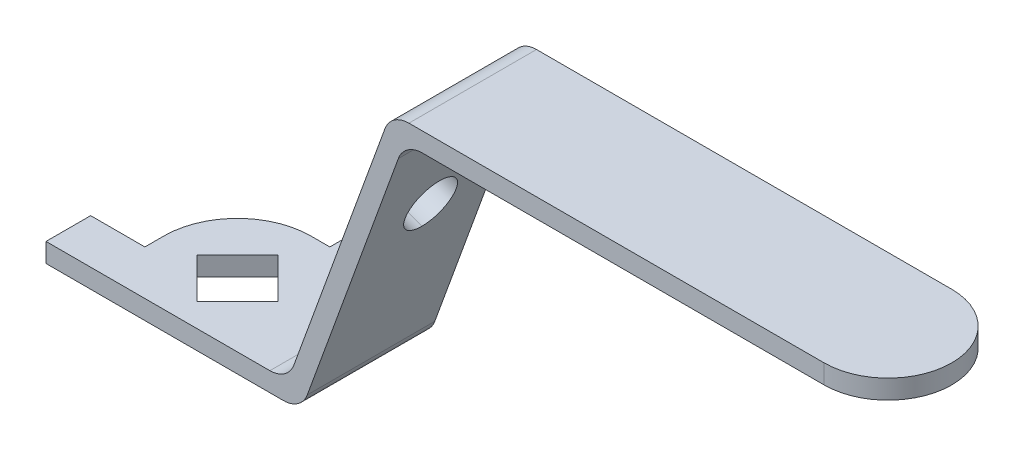
ISO-10303-21;
HEADER;
FILE_DESCRIPTION(('STEP AP214'),'2;1');
FILE_NAME('part.step','',(''),(''),'','','');
FILE_SCHEMA(('AUTOMOTIVE_DESIGN { 1 0 10303 214 1 1 1 1 }'));
ENDSEC;
DATA;
#1=APPLICATION_CONTEXT('core data for automotive mechanical design processes');
#2=APPLICATION_PROTOCOL_DEFINITION('international standard','automotive_design',2000,#1);
#3=PRODUCT_CONTEXT('',#1,'mechanical');
#4=PRODUCT('Part','Part','',(#3));
#5=PRODUCT_RELATED_PRODUCT_CATEGORY('part','',(#4));
#6=PRODUCT_DEFINITION_FORMATION('','',#4);
#7=PRODUCT_DEFINITION_CONTEXT('part definition',#1,'design');
#8=PRODUCT_DEFINITION('design','',#6,#7);
#9=PRODUCT_DEFINITION_SHAPE('','',#8);
#10=(LENGTH_UNIT() NAMED_UNIT(*) SI_UNIT(.MILLI.,.METRE.));
#11=(NAMED_UNIT(*) PLANE_ANGLE_UNIT() SI_UNIT($,.RADIAN.));
#12=(NAMED_UNIT(*) SI_UNIT($,.STERADIAN.) SOLID_ANGLE_UNIT());
#13=UNCERTAINTY_MEASURE_WITH_UNIT(LENGTH_MEASURE(1.E-05),#10,'distance_accuracy_value','');
#14=(GEOMETRIC_REPRESENTATION_CONTEXT(3) GLOBAL_UNCERTAINTY_ASSIGNED_CONTEXT((#13)) GLOBAL_UNIT_ASSIGNED_CONTEXT((#10,
#11,#12)) REPRESENTATION_CONTEXT('',''));
#15=CARTESIAN_POINT('',(0.,0.,0.));
#16=DIRECTION('',(0.,0.,1.));
#17=DIRECTION('',(1.,0.,0.));
#18=AXIS2_PLACEMENT_3D('',#15,#16,#17);
#19=CARTESIAN_POINT('',(33.9922257180665,62.7433443998355,74.1271242589921));
#20=DIRECTION('',(0.,0.,-1.));
#21=DIRECTION('',(1.,0.,0.));
#22=AXIS2_PLACEMENT_3D('',#19,#20,#21);
#23=CYLINDRICAL_SURFACE('',#22,4.);
#24=CARTESIAN_POINT('',(33.9922257180665,62.7433443998355,64.127124258992));
#25=DIRECTION('',(0.,0.,1.));
#26=DIRECTION('',(-1.,0.,0.));
#27=AXIS2_PLACEMENT_3D('',#24,#25,#26);
#28=CIRCLE('',#27,4.);
#29=CARTESIAN_POINT('',(33.9922257180665,66.7433443998355,64.127124258992));
#30=VERTEX_POINT('',#29);
#31=CARTESIAN_POINT('',(30.2334552349229,64.1114249731381,64.127124258992));
#32=VERTEX_POINT('',#31);
#33=EDGE_CURVE('E446',#30,#32,#28,.T.);
#34=ORIENTED_EDGE('',*,*,#33,.F.);
#35=DIRECTION('',(0.,0.,1.));
#36=VECTOR('',#35,1.);
#37=CARTESIAN_POINT('',(33.9922257180665,66.7433443998355,74.1271242589921));
#38=LINE('',#37,#36);
#39=CARTESIAN_POINT('',(33.9922257180665,66.7433443998355,44.127124258992));
#40=VERTEX_POINT('',#39);
#41=EDGE_CURVE('E276',#40,#30,#38,.T.);
#42=ORIENTED_EDGE('',*,*,#41,.F.);
#43=CARTESIAN_POINT('',(33.9922257180665,62.7433443998355,44.127124258992));
#44=DIRECTION('',(0.,0.,-1.));
#45=DIRECTION('',(-1.,0.,0.));
#46=AXIS2_PLACEMENT_3D('',#43,#44,#45);
#47=CIRCLE('',#46,4.);
#48=CARTESIAN_POINT('',(30.2334552349229,64.1114249731381,44.127124258992));
#49=VERTEX_POINT('',#48);
#50=EDGE_CURVE('E295',#49,#40,#47,.T.);
#51=ORIENTED_EDGE('',*,*,#50,.F.);
#52=DIRECTION('',(0.,0.,-1.));
#53=VECTOR('',#52,1.);
#54=CARTESIAN_POINT('',(30.2334552349229,64.1114249731381,74.1271242589921));
#55=LINE('',#54,#53);
#56=EDGE_CURVE('E332',#32,#49,#55,.T.);
#57=ORIENTED_EDGE('',*,*,#56,.F.);
#58=EDGE_LOOP('',(#34,#42,#51,#57));
#59=FACE_BOUND('',#58,.T.);
#60=ADVANCED_FACE('F16',(#59),#23,.T.);
#61=CARTESIAN_POINT('',(12.1915589660648,26.23693997096,74.1271242589921));
#62=DIRECTION('',(0.,0.,1.));
#63=DIRECTION('',(-1.,0.,0.));
#64=AXIS2_PLACEMENT_3D('',#61,#62,#63);
#65=CYLINDRICAL_SURFACE('',#64,4.);
#66=CARTESIAN_POINT('',(12.1915589660648,26.23693997096,64.127124258992));
#67=DIRECTION('',(0.,0.,-1.));
#68=DIRECTION('',(-1.,0.,0.));
#69=AXIS2_PLACEMENT_3D('',#66,#67,#68);
#70=CIRCLE('',#69,4.);
#71=CARTESIAN_POINT('',(15.9503294492085,24.8688593976574,64.127124258992));
#72=VERTEX_POINT('',#71);
#73=CARTESIAN_POINT('',(12.1915589660648,22.23693997096,64.127124258992));
#74=VERTEX_POINT('',#73);
#75=EDGE_CURVE('E442',#72,#74,#70,.T.);
#76=ORIENTED_EDGE('',*,*,#75,.F.);
#77=DIRECTION('',(0.,0.,1.));
#78=VECTOR('',#77,1.);
#79=CARTESIAN_POINT('',(15.9503294492085,24.8688593976574,64.127124258992));
#80=LINE('',#79,#78);
#81=CARTESIAN_POINT('',(15.9503294492085,24.8688593976574,44.127124258992));
#82=VERTEX_POINT('',#81);
#83=EDGE_CURVE('E319',#82,#72,#80,.T.);
#84=ORIENTED_EDGE('',*,*,#83,.F.);
#85=CARTESIAN_POINT('',(12.1915589660648,26.23693997096,44.127124258992));
#86=DIRECTION('',(0.,0.,1.));
#87=DIRECTION('',(-1.,0.,0.));
#88=AXIS2_PLACEMENT_3D('',#85,#86,#87);
#89=CIRCLE('',#88,4.);
#90=CARTESIAN_POINT('',(12.1915589660648,22.23693997096,44.127124258992));
#91=VERTEX_POINT('',#90);
#92=EDGE_CURVE('E299',#91,#82,#89,.T.);
#93=ORIENTED_EDGE('',*,*,#92,.F.);
#94=DIRECTION('',(0.,0.,-1.));
#95=VECTOR('',#94,1.);
#96=CARTESIAN_POINT('',(12.1915589660648,22.23693997096,44.127124258992));
#97=LINE('',#96,#95);
#98=EDGE_CURVE('E362',#74,#91,#97,.T.);
#99=ORIENTED_EDGE('',*,*,#98,.F.);
#100=EDGE_LOOP('',(#76,#84,#93,#99));
#101=FACE_BOUND('',#100,.T.);
#102=ADVANCED_FACE('F591',(#101),#65,.F.);
#103=CARTESIAN_POINT('',(14.292181580694,23.23693997096,74.1271242589921));
#104=DIRECTION('',(0.,0.,-1.));
#105=DIRECTION('',(1.,0.,0.));
#106=AXIS2_PLACEMENT_3D('',#103,#104,#105);
#107=CYLINDRICAL_SURFACE('',#106,4.);
#108=CARTESIAN_POINT('',(14.292181580694,23.23693997096,64.127124258992));
#109=DIRECTION('',(0.,0.,1.));
#110=DIRECTION('',(-1.,0.,0.));
#111=AXIS2_PLACEMENT_3D('',#108,#109,#110);
#112=CIRCLE('',#111,4.);
#113=CARTESIAN_POINT('',(14.292181580694,19.23693997096,64.127124258992));
#114=VERTEX_POINT('',#113);
#115=CARTESIAN_POINT('',(18.0509520638376,21.8688593976574,64.127124258992));
#116=VERTEX_POINT('',#115);
#117=EDGE_CURVE('E36',#114,#116,#112,.T.);
#118=ORIENTED_EDGE('',*,*,#117,.F.);
#119=DIRECTION('',(0.,0.,1.));
#120=VECTOR('',#119,1.);
#121=CARTESIAN_POINT('',(14.292181580694,19.23693997096,74.1271242589921));
#122=LINE('',#121,#120);
#123=CARTESIAN_POINT('',(14.292181580694,19.23693997096,44.127124258992));
#124=VERTEX_POINT('',#123);
#125=EDGE_CURVE('E421',#124,#114,#122,.T.);
#126=ORIENTED_EDGE('',*,*,#125,.F.);
#127=CARTESIAN_POINT('',(14.292181580694,23.23693997096,44.127124258992));
#128=DIRECTION('',(0.,0.,-1.));
#129=DIRECTION('',(-1.,0.,0.));
#130=AXIS2_PLACEMENT_3D('',#127,#128,#129);
#131=CIRCLE('',#130,4.);
#132=CARTESIAN_POINT('',(18.0509520638376,21.8688593976574,44.127124258992));
#133=VERTEX_POINT('',#132);
#134=EDGE_CURVE('E502',#133,#124,#131,.T.);
#135=ORIENTED_EDGE('',*,*,#134,.F.);
#136=DIRECTION('',(0.,0.,-1.));
#137=VECTOR('',#136,1.);
#138=CARTESIAN_POINT('',(18.0509520638376,21.8688593976574,74.1271242589921));
#139=LINE('',#138,#137);
#140=EDGE_CURVE('E249',#116,#133,#139,.T.);
#141=ORIENTED_EDGE('',*,*,#140,.F.);
#142=EDGE_LOOP('',(#118,#126,#135,#141));
#143=FACE_BOUND('',#142,.T.);
#144=ADVANCED_FACE('F550',(#143),#107,.T.);
#145=CARTESIAN_POINT('',(36.0928483326956,59.7433443998355,74.1271242589921));
#146=DIRECTION('',(0.,0.,1.));
#147=DIRECTION('',(-1.,0.,0.));
#148=AXIS2_PLACEMENT_3D('',#145,#146,#147);
#149=CYLINDRICAL_SURFACE('',#148,4.);
#150=CARTESIAN_POINT('',(36.0928483326956,59.7433443998355,64.127124258992));
#151=DIRECTION('',(0.,0.,-1.));
#152=DIRECTION('',(-1.,0.,0.));
#153=AXIS2_PLACEMENT_3D('',#150,#151,#152);
#154=CIRCLE('',#153,4.);
#155=CARTESIAN_POINT('',(32.334077849552,61.1114249731381,64.127124258992));
#156=VERTEX_POINT('',#155);
#157=CARTESIAN_POINT('',(36.0928483326956,63.7433443998355,64.127124258992));
#158=VERTEX_POINT('',#157);
#159=EDGE_CURVE('E46',#156,#158,#154,.T.);
#160=ORIENTED_EDGE('',*,*,#159,.F.);
#161=DIRECTION('',(0.,0.,1.));
#162=VECTOR('',#161,1.);
#163=CARTESIAN_POINT('',(32.334077849552,61.1114249731381,64.127124258992));
#164=LINE('',#163,#162);
#165=CARTESIAN_POINT('',(32.334077849552,61.1114249731381,44.127124258992));
#166=VERTEX_POINT('',#165);
#167=EDGE_CURVE('E472',#166,#156,#164,.T.);
#168=ORIENTED_EDGE('',*,*,#167,.F.);
#169=CARTESIAN_POINT('',(36.0928483326956,59.7433443998355,44.127124258992));
#170=DIRECTION('',(0.,0.,1.));
#171=DIRECTION('',(-1.,0.,0.));
#172=AXIS2_PLACEMENT_3D('',#169,#170,#171);
#173=CIRCLE('',#172,4.);
#174=CARTESIAN_POINT('',(36.0928483326956,63.7433443998355,44.127124258992));
#175=VERTEX_POINT('',#174);
#176=EDGE_CURVE('E298',#175,#166,#173,.T.);
#177=ORIENTED_EDGE('',*,*,#176,.F.);
#178=DIRECTION('',(0.,0.,-1.));
#179=VECTOR('',#178,1.);
#180=CARTESIAN_POINT('',(36.0928483326956,63.7433443998355,44.127124258992));
#181=LINE('',#180,#179);
#182=EDGE_CURVE('E303',#158,#175,#181,.T.);
#183=ORIENTED_EDGE('',*,*,#182,.F.);
#184=EDGE_LOOP('',(#160,#168,#177,#183));
#185=FACE_BOUND('',#184,.T.);
#186=ADVANCED_FACE('F610',(#185),#149,.F.);
#187=CARTESIAN_POINT('',(90.347436587036,24.6069233201689,54.127124258992));
#188=DIRECTION('',(-0.93969262078591,0.342020143325666,0.));
#189=DIRECTION('',(0.342020143325666,0.93969262078591,0.));
#190=AXIS2_PLACEMENT_3D('',#187,#188,#189);
#191=CYLINDRICAL_SURFACE('',#190,4.);
#192=DIRECTION('',(-0.93969262078591,0.342020143325665,0.));
#193=VECTOR('',#192,1.);
#194=CARTESIAN_POINT('',(91.7155171603387,28.3656938033125,54.127124258992));
#195=LINE('',#194,#193);
#196=CARTESIAN_POINT('',(28.7561115676827,51.2810434061321,54.127124258992));
#197=VERTEX_POINT('',#196);
#198=CARTESIAN_POINT('',(25.937033705325,52.3071038361091,54.127124258992));
#199=VERTEX_POINT('',#198);
#200=EDGE_CURVE('E252',#197,#199,#195,.T.);
#201=ORIENTED_EDGE('',*,*,#200,.F.);
#202=CARTESIAN_POINT('',(27.3880309943801,47.5222729229885,54.127124258992));
#203=DIRECTION('',(-0.93969262078591,0.342020143325666,0.));
#204=DIRECTION('',(-0.342020143325666,-0.93969262078591,0.));
#205=AXIS2_PLACEMENT_3D('',#202,#203,#204);
#206=CIRCLE('',#205,4.);
#207=CARTESIAN_POINT('',(26.0199504210774,43.7635024398449,54.127124258992));
#208=VERTEX_POINT('',#207);
#209=EDGE_CURVE('E238',#208,#197,#206,.T.);
#210=ORIENTED_EDGE('',*,*,#209,.F.);
#211=DIRECTION('',(-0.93969262078591,0.342020143325665,0.));
#212=VECTOR('',#211,1.);
#213=CARTESIAN_POINT('',(88.9793560137333,20.8481528370253,54.127124258992));
#214=LINE('',#213,#212);
#215=CARTESIAN_POINT('',(23.2008725587197,44.7895628698219,54.127124258992));
#216=VERTEX_POINT('',#215);
#217=EDGE_CURVE('E262',#208,#216,#214,.T.);
#218=ORIENTED_EDGE('',*,*,#217,.T.);
#219=CARTESIAN_POINT('',(24.5689531320223,48.5483333529655,54.127124258992));
#220=DIRECTION('',(-0.93969262078591,0.342020143325666,0.));
#221=DIRECTION('',(-0.342020143325666,-0.93969262078591,0.));
#222=AXIS2_PLACEMENT_3D('',#219,#220,#221);
#223=CIRCLE('',#222,4.);
#224=EDGE_CURVE('E254',#216,#199,#223,.T.);
#225=ORIENTED_EDGE('',*,*,#224,.T.);
#226=EDGE_LOOP('',(#201,#210,#218,#225));
#227=FACE_BOUND('',#226,.T.);
#228=ADVANCED_FACE('F253',(#227),#191,.F.);
#229=CARTESIAN_POINT('',(0.274992248872268,-30.76306002904,50.9451437436526));
#230=DIRECTION('',(0.707106781186546,0.,-0.707106781186549));
#231=DIRECTION('',(0.,-1.,0.));
#232=AXIS2_PLACEMENT_3D('',#229,#230,#231);
#233=PLANE('',#232);
#234=DIRECTION('',(-0.707106781186549,0.,-0.707106781186546));
#235=VECTOR('',#234,1.);
#236=CARTESIAN_POINT('',(10.2749922488723,22.23693997096,60.9451437436526));
#237=LINE('',#236,#235);
#238=CARTESIAN_POINT('',(3.45697276421174,22.23693997096,54.127124258992));
#239=VERTEX_POINT('',#238);
#240=CARTESIAN_POINT('',(-2.9069882664672,22.23693997096,47.7631632283131));
#241=VERTEX_POINT('',#240);
#242=EDGE_CURVE('E313',#239,#241,#237,.T.);
#243=ORIENTED_EDGE('',*,*,#242,.T.);
#244=DIRECTION('',(0.,1.,0.));
#245=VECTOR('',#244,1.);
#246=CARTESIAN_POINT('',(-2.9069882664672,-30.76306002904,47.7631632283131));
#247=LINE('',#246,#245);
#248=CARTESIAN_POINT('',(-2.9069882664672,19.23693997096,47.7631632283131));
#249=VERTEX_POINT('',#248);
#250=EDGE_CURVE('E11',#249,#241,#247,.T.);
#251=ORIENTED_EDGE('',*,*,#250,.F.);
#252=DIRECTION('',(-0.707106781186549,0.,-0.707106781186546));
#253=VECTOR('',#252,1.);
#254=CARTESIAN_POINT('',(10.2749922488723,19.23693997096,60.9451437436526));
#255=LINE('',#254,#253);
#256=CARTESIAN_POINT('',(3.45697276421174,19.23693997096,54.127124258992));
#257=VERTEX_POINT('',#256);
#258=EDGE_CURVE('E460',#257,#249,#255,.T.);
#259=ORIENTED_EDGE('',*,*,#258,.F.);
#260=DIRECTION('',(0.,1.,0.));
#261=VECTOR('',#260,1.);
#262=CARTESIAN_POINT('',(3.45697276421174,-30.76306002904,54.127124258992));
#263=LINE('',#262,#261);
#264=EDGE_CURVE('E445',#257,#239,#263,.T.);
#265=ORIENTED_EDGE('',*,*,#264,.T.);
#266=EDGE_LOOP('',(#243,#251,#259,#265));
#267=FACE_BOUND('',#266,.T.);
#268=ADVANCED_FACE('F536',(#267),#233,.F.);
#269=CARTESIAN_POINT('',(-6.08896878180666,-30.76306002904,50.9451437436526));
#270=DIRECTION('',(0.707106781186549,0.,0.707106781186546));
#271=DIRECTION('',(0.,-1.,0.));
#272=AXIS2_PLACEMENT_3D('',#269,#270,#271);
#273=PLANE('',#272);
#274=DIRECTION('',(0.,1.,0.));
#275=VECTOR('',#274,1.);
#276=CARTESIAN_POINT('',(-9.27094929714612,-30.76306002904,54.1271242589921));
#277=LINE('',#276,#275);
#278=CARTESIAN_POINT('',(-9.27094929714612,19.23693997096,54.1271242589921));
#279=VERTEX_POINT('',#278);
#280=CARTESIAN_POINT('',(-9.27094929714612,22.23693997096,54.1271242589921));
#281=VERTEX_POINT('',#280);
#282=EDGE_CURVE('E19',#279,#281,#277,.T.);
#283=ORIENTED_EDGE('',*,*,#282,.F.);
#284=DIRECTION('',(0.707106781186546,0.,-0.707106781186549));
#285=VECTOR('',#284,1.);
#286=CARTESIAN_POINT('',(-16.0889687818067,19.23693997096,60.9451437436526));
#287=LINE('',#286,#285);
#288=EDGE_CURVE('E464',#279,#249,#287,.T.);
#289=ORIENTED_EDGE('',*,*,#288,.T.);
#290=ORIENTED_EDGE('',*,*,#250,.T.);
#291=DIRECTION('',(0.707106781186546,0.,-0.707106781186549));
#292=VECTOR('',#291,1.);
#293=CARTESIAN_POINT('',(-16.0889687818067,22.23693997096,60.9451437436526));
#294=LINE('',#293,#292);
#295=EDGE_CURVE('E318',#281,#241,#294,.T.);
#296=ORIENTED_EDGE('',*,*,#295,.F.);
#297=EDGE_LOOP('',(#283,#289,#290,#296));
#298=FACE_BOUND('',#297,.T.);
#299=ADVANCED_FACE('F528',(#298),#273,.T.);
#300=CARTESIAN_POINT('',(-6.08896878180665,-30.76306002904,57.3091047743315));
#301=DIRECTION('',(0.707106781186546,0.,-0.707106781186549));
#302=DIRECTION('',(0.,-1.,0.));
#303=AXIS2_PLACEMENT_3D('',#300,#301,#302);
#304=PLANE('',#303);
#305=DIRECTION('',(0.,1.,0.));
#306=VECTOR('',#305,1.);
#307=CARTESIAN_POINT('',(-2.90698826646718,-30.76306002904,60.491085289671));
#308=LINE('',#307,#306);
#309=CARTESIAN_POINT('',(-2.90698826646718,19.23693997096,60.491085289671));
#310=VERTEX_POINT('',#309);
#311=CARTESIAN_POINT('',(-2.90698826646718,22.23693997096,60.491085289671));
#312=VERTEX_POINT('',#311);
#313=EDGE_CURVE('E512',#310,#312,#308,.T.);
#314=ORIENTED_EDGE('',*,*,#313,.F.);
#315=DIRECTION('',(-0.707106781186549,0.,-0.707106781186546));
#316=VECTOR('',#315,1.);
#317=CARTESIAN_POINT('',(3.91103121819335,19.23693997096,67.3091047743315));
#318=LINE('',#317,#316);
#319=EDGE_CURVE('E273',#310,#279,#318,.T.);
#320=ORIENTED_EDGE('',*,*,#319,.T.);
#321=ORIENTED_EDGE('',*,*,#282,.T.);
#322=DIRECTION('',(-0.707106781186549,0.,-0.707106781186546));
#323=VECTOR('',#322,1.);
#324=CARTESIAN_POINT('',(3.91103121819335,22.23693997096,67.3091047743315));
#325=LINE('',#324,#323);
#326=EDGE_CURVE('E411',#312,#281,#325,.T.);
#327=ORIENTED_EDGE('',*,*,#326,.F.);
#328=EDGE_LOOP('',(#314,#320,#321,#327));
#329=FACE_BOUND('',#328,.T.);
#330=ADVANCED_FACE('F523',(#329),#304,.T.);
#331=CARTESIAN_POINT('',(0.274992248872278,-30.76306002904,57.3091047743315));
#332=DIRECTION('',(0.707106781186549,0.,0.707106781186546));
#333=DIRECTION('',(0.,-1.,0.));
#334=AXIS2_PLACEMENT_3D('',#331,#332,#333);
#335=PLANE('',#334);
#336=DIRECTION('',(0.707106781186546,0.,-0.707106781186549));
#337=VECTOR('',#336,1.);
#338=CARTESIAN_POINT('',(-9.72500775112772,22.23693997096,67.3091047743316));
#339=LINE('',#338,#337);
#340=EDGE_CURVE('E407',#312,#239,#339,.T.);
#341=ORIENTED_EDGE('',*,*,#340,.T.);
#342=ORIENTED_EDGE('',*,*,#264,.F.);
#343=DIRECTION('',(0.707106781186546,0.,-0.707106781186549));
#344=VECTOR('',#343,1.);
#345=CARTESIAN_POINT('',(-9.72500775112772,19.23693997096,67.3091047743316));
#346=LINE('',#345,#344);
#347=EDGE_CURVE('E285',#310,#257,#346,.T.);
#348=ORIENTED_EDGE('',*,*,#347,.F.);
#349=ORIENTED_EDGE('',*,*,#313,.T.);
#350=EDGE_LOOP('',(#341,#342,#348,#349));
#351=FACE_BOUND('',#350,.T.);
#352=ADVANCED_FACE('F533',(#351),#335,.F.);
#353=CARTESIAN_POINT('',(7.09301173353281,-30.76306002904,54.127124258992));
#354=DIRECTION('',(-1.,0.,0.));
#355=DIRECTION('',(0.,0.,1.));
#356=AXIS2_PLACEMENT_3D('',#353,#354,#355);
#357=PLANE('',#356);
#358=DIRECTION('',(0.,0.,1.));
#359=VECTOR('',#358,1.);
#360=CARTESIAN_POINT('',(7.09301173353281,22.23693997096,74.1271242589921));
#361=LINE('',#360,#359);
#362=CARTESIAN_POINT('',(7.09301173353281,22.23693997096,34.127124258992));
#363=VERTEX_POINT('',#362);
#364=CARTESIAN_POINT('',(7.09301173353281,22.23693997096,44.127124258992));
#365=VERTEX_POINT('',#364);
#366=EDGE_CURVE('E370',#363,#365,#361,.T.);
#367=ORIENTED_EDGE('',*,*,#366,.T.);
#368=DIRECTION('',(0.,1.,0.));
#369=VECTOR('',#368,1.);
#370=CARTESIAN_POINT('',(7.09301173353281,-30.76306002904,44.127124258992));
#371=LINE('',#370,#369);
#372=CARTESIAN_POINT('',(7.09301173353281,19.23693997096,44.127124258992));
#373=VERTEX_POINT('',#372);
#374=EDGE_CURVE('E270',#373,#365,#371,.T.);
#375=ORIENTED_EDGE('',*,*,#374,.F.);
#376=DIRECTION('',(0.,0.,1.));
#377=VECTOR('',#376,1.);
#378=CARTESIAN_POINT('',(7.09301173353281,19.23693997096,74.1271242589921));
#379=LINE('',#378,#377);
#380=CARTESIAN_POINT('',(7.09301173353281,19.23693997096,34.127124258992));
#381=VERTEX_POINT('',#380);
#382=EDGE_CURVE('E271',#381,#373,#379,.T.);
#383=ORIENTED_EDGE('',*,*,#382,.F.);
#384=DIRECTION('',(0.,1.,0.));
#385=VECTOR('',#384,1.);
#386=CARTESIAN_POINT('',(7.09301173353281,19.23693997096,34.127124258992));
#387=LINE('',#386,#385);
#388=EDGE_CURVE('E248',#381,#363,#387,.T.);
#389=ORIENTED_EDGE('',*,*,#388,.T.);
#390=EDGE_LOOP('',(#367,#375,#383,#389));
#391=FACE_BOUND('',#390,.T.);
#392=ADVANCED_FACE('F582',(#391),#357,.F.);
#393=CARTESIAN_POINT('',(-2.90698826646719,-30.76306002904,64.127124258992));
#394=DIRECTION('',(0.,0.,-1.));
#395=DIRECTION('',(-1.,0.,0.));
#396=AXIS2_PLACEMENT_3D('',#393,#394,#395);
#397=PLANE('',#396);
#398=DIRECTION('',(-1.,0.,0.));
#399=VECTOR('',#398,1.);
#400=CARTESIAN_POINT('',(-2.90698826646719,19.23693997096,64.127124258992));
#401=LINE('',#400,#399);
#402=CARTESIAN_POINT('',(-22.9069882664672,19.23693997096,64.127124258992));
#403=VERTEX_POINT('',#402);
#404=EDGE_CURVE('E425',#114,#403,#401,.T.);
#405=ORIENTED_EDGE('',*,*,#404,.F.);
#406=ORIENTED_EDGE('',*,*,#117,.T.);
#407=DIRECTION('',(-0.342020143325665,-0.93969262078591,0.));
#408=VECTOR('',#407,1.);
#409=CARTESIAN_POINT('',(17.0930117335328,19.23693997096,64.127124258992));
#410=LINE('',#409,#408);
#411=EDGE_CURVE('E476',#156,#116,#410,.T.);
#412=ORIENTED_EDGE('',*,*,#411,.F.);
#413=ORIENTED_EDGE('',*,*,#159,.T.);
#414=DIRECTION('',(-1.,0.,0.));
#415=VECTOR('',#414,1.);
#416=CARTESIAN_POINT('',(33.2920181798568,63.7433443998355,64.127124258992));
#417=LINE('',#416,#415);
#418=CARTESIAN_POINT('',(99.0930117335328,63.7433443998355,64.127124258992));
#419=VERTEX_POINT('',#418);
#420=EDGE_CURVE('E294',#419,#158,#417,.T.);
#421=ORIENTED_EDGE('',*,*,#420,.F.);
#422=DIRECTION('',(0.,1.,0.));
#423=VECTOR('',#422,1.);
#424=CARTESIAN_POINT('',(99.0930117335328,-30.76306002904,64.127124258992));
#425=LINE('',#424,#423);
#426=CARTESIAN_POINT('',(99.0930117335328,66.7433443998355,64.127124258992));
#427=VERTEX_POINT('',#426);
#428=EDGE_CURVE('E311',#419,#427,#425,.T.);
#429=ORIENTED_EDGE('',*,*,#428,.T.);
#430=DIRECTION('',(-1.,0.,0.));
#431=VECTOR('',#430,1.);
#432=CARTESIAN_POINT('',(33.2920181798568,66.7433443998355,64.127124258992));
#433=LINE('',#432,#431);
#434=EDGE_CURVE('E280',#427,#30,#433,.T.);
#435=ORIENTED_EDGE('',*,*,#434,.T.);
#436=ORIENTED_EDGE('',*,*,#33,.T.);
#437=DIRECTION('',(-0.342020143325665,-0.93969262078591,0.));
#438=VECTOR('',#437,1.);
#439=CARTESIAN_POINT('',(14.2739338711751,20.263000400937,64.127124258992));
#440=LINE('',#439,#438);
#441=EDGE_CURVE('E323',#32,#72,#440,.T.);
#442=ORIENTED_EDGE('',*,*,#441,.T.);
#443=ORIENTED_EDGE('',*,*,#75,.T.);
#444=DIRECTION('',(-1.,0.,0.));
#445=VECTOR('',#444,1.);
#446=CARTESIAN_POINT('',(-2.90698826646719,22.23693997096,64.127124258992));
#447=LINE('',#446,#445);
#448=CARTESIAN_POINT('',(-22.9069882664672,22.23693997096,64.127124258992));
#449=VERTEX_POINT('',#448);
#450=EDGE_CURVE('E358',#74,#449,#447,.T.);
#451=ORIENTED_EDGE('',*,*,#450,.T.);
#452=DIRECTION('',(0.,1.,0.));
#453=VECTOR('',#452,1.);
#454=CARTESIAN_POINT('',(-22.9069882664672,-30.76306002904,64.127124258992));
#455=LINE('',#454,#453);
#456=EDGE_CURVE('E491',#403,#449,#455,.T.);
#457=ORIENTED_EDGE('',*,*,#456,.F.);
#458=EDGE_LOOP('',(#405,#406,#412,#413,#421,#429,#435,#436,#442,#443,#451,#457));
#459=FACE_BOUND('',#458,.T.);
#460=ADVANCED_FACE('F551',(#459),#397,.F.);
#461=CARTESIAN_POINT('',(-2.90698826646719,-30.76306002904,44.127124258992));
#462=DIRECTION('',(0.,0.,-1.));
#463=DIRECTION('',(0.,-1.,0.));
#464=AXIS2_PLACEMENT_3D('',#461,#462,#463);
#465=PLANE('',#464);
#466=DIRECTION('',(-0.342020143325665,-0.93969262078591,0.));
#467=VECTOR('',#466,1.);
#468=CARTESIAN_POINT('',(17.0930117335328,19.23693997096,44.127124258992));
#469=LINE('',#468,#467);
#470=EDGE_CURVE('E468',#166,#133,#469,.T.);
#471=ORIENTED_EDGE('',*,*,#470,.T.);
#472=ORIENTED_EDGE('',*,*,#134,.T.);
#473=DIRECTION('',(-1.,0.,0.));
#474=VECTOR('',#473,1.);
#475=CARTESIAN_POINT('',(-2.90698826646719,19.23693997096,44.127124258992));
#476=LINE('',#475,#474);
#477=EDGE_CURVE('E317',#124,#373,#476,.T.);
#478=ORIENTED_EDGE('',*,*,#477,.T.);
#479=ORIENTED_EDGE('',*,*,#374,.T.);
#480=DIRECTION('',(-1.,0.,0.));
#481=VECTOR('',#480,1.);
#482=CARTESIAN_POINT('',(-2.90698826646719,22.23693997096,44.127124258992));
#483=LINE('',#482,#481);
#484=EDGE_CURVE('E366',#91,#365,#483,.T.);
#485=ORIENTED_EDGE('',*,*,#484,.F.);
#486=ORIENTED_EDGE('',*,*,#92,.T.);
#487=DIRECTION('',(-0.342020143325665,-0.93969262078591,0.));
#488=VECTOR('',#487,1.);
#489=CARTESIAN_POINT('',(14.2739338711751,20.263000400937,44.127124258992));
#490=LINE('',#489,#488);
#491=EDGE_CURVE('E324',#49,#82,#490,.T.);
#492=ORIENTED_EDGE('',*,*,#491,.F.);
#493=ORIENTED_EDGE('',*,*,#50,.T.);
#494=DIRECTION('',(-1.,0.,0.));
#495=VECTOR('',#494,1.);
#496=CARTESIAN_POINT('',(33.2920181798568,66.7433443998355,44.127124258992));
#497=LINE('',#496,#495);
#498=CARTESIAN_POINT('',(99.0930117335328,66.7433443998355,44.127124258992));
#499=VERTEX_POINT('',#498);
#500=EDGE_CURVE('E281',#499,#40,#497,.T.);
#501=ORIENTED_EDGE('',*,*,#500,.F.);
#502=DIRECTION('',(0.,1.,0.));
#503=VECTOR('',#502,1.);
#504=CARTESIAN_POINT('',(99.0930117335328,-30.76306002904,44.127124258992));
#505=LINE('',#504,#503);
#506=CARTESIAN_POINT('',(99.0930117335328,63.7433443998355,44.127124258992));
#507=VERTEX_POINT('',#506);
#508=EDGE_CURVE('E308',#507,#499,#505,.T.);
#509=ORIENTED_EDGE('',*,*,#508,.F.);
#510=DIRECTION('',(-1.,0.,0.));
#511=VECTOR('',#510,1.);
#512=CARTESIAN_POINT('',(33.2920181798568,63.7433443998355,44.127124258992));
#513=LINE('',#512,#511);
#514=EDGE_CURVE('E307',#507,#175,#513,.T.);
#515=ORIENTED_EDGE('',*,*,#514,.T.);
#516=ORIENTED_EDGE('',*,*,#176,.T.);
#517=EDGE_LOOP('',(#471,#472,#478,#479,#485,#486,#492,#493,#501,#509,#515,#516));
#518=FACE_BOUND('',#517,.T.);
#519=ADVANCED_FACE('F546',(#518),#465,.T.);
#520=CARTESIAN_POINT('',(99.0930117335328,-30.76306002904,54.127124258992));
#521=DIRECTION('',(0.,1.,0.));
#522=DIRECTION('',(0.,0.,-1.));
#523=AXIS2_PLACEMENT_3D('',#520,#521,#522);
#524=CYLINDRICAL_SURFACE('',#523,10.);
#525=CARTESIAN_POINT('',(99.0930117335328,63.7433443998355,54.127124258992));
#526=DIRECTION('',(0.,1.,0.));
#527=DIRECTION('',(0.,0.,1.));
#528=AXIS2_PLACEMENT_3D('',#525,#526,#527);
#529=CIRCLE('',#528,10.);
#530=EDGE_CURVE('E328',#419,#507,#529,.T.);
#531=ORIENTED_EDGE('',*,*,#530,.T.);
#532=ORIENTED_EDGE('',*,*,#508,.T.);
#533=CARTESIAN_POINT('',(99.0930117335328,66.7433443998355,54.127124258992));
#534=DIRECTION('',(0.,1.,0.));
#535=DIRECTION('',(0.,0.,1.));
#536=AXIS2_PLACEMENT_3D('',#533,#534,#535);
#537=CIRCLE('',#536,10.);
#538=EDGE_CURVE('E290',#427,#499,#537,.T.);
#539=ORIENTED_EDGE('',*,*,#538,.F.);
#540=ORIENTED_EDGE('',*,*,#428,.F.);
#541=EDGE_LOOP('',(#531,#532,#539,#540));
#542=FACE_BOUND('',#541,.T.);
#543=ADVANCED_FACE('F604',(#542),#524,.T.);
#544=CARTESIAN_POINT('',(-2.90698826646719,-30.76306002904,42.6271242589921));
#545=DIRECTION('',(0.,0.,-1.));
#546=DIRECTION('',(0.,-1.,0.));
#547=AXIS2_PLACEMENT_3D('',#544,#545,#546);
#548=PLANE('',#547);
#549=DIRECTION('',(0.,1.,0.));
#550=VECTOR('',#549,1.);
#551=CARTESIAN_POINT('',(0.0930117335328079,-30.76306002904,42.6271242589921));
#552=LINE('',#551,#550);
#553=CARTESIAN_POINT('',(0.0930117335328079,19.23693997096,42.6271242589921));
#554=VERTEX_POINT('',#553);
#555=CARTESIAN_POINT('',(0.0930117335328079,22.23693997096,42.6271242589921));
#556=VERTEX_POINT('',#555);
#557=EDGE_CURVE('E312',#554,#556,#552,.T.);
#558=ORIENTED_EDGE('',*,*,#557,.F.);
#559=DIRECTION('',(-1.,0.,0.));
#560=VECTOR('',#559,1.);
#561=CARTESIAN_POINT('',(-2.90698826646719,19.23693997096,42.6271242589921));
#562=LINE('',#561,#560);
#563=CARTESIAN_POINT('',(-2.90698826646711,19.23693997096,42.6271242589921));
#564=VERTEX_POINT('',#563);
#565=EDGE_CURVE('E441',#554,#564,#562,.T.);
#566=ORIENTED_EDGE('',*,*,#565,.T.);
#567=DIRECTION('',(0.,1.,0.));
#568=VECTOR('',#567,1.);
#569=CARTESIAN_POINT('',(-2.90698826646711,-30.76306002904,42.6271242589921));
#570=LINE('',#569,#568);
#571=CARTESIAN_POINT('',(-2.90698826646711,22.23693997096,42.6271242589921));
#572=VERTEX_POINT('',#571);
#573=EDGE_CURVE('E402',#564,#572,#570,.T.);
#574=ORIENTED_EDGE('',*,*,#573,.T.);
#575=DIRECTION('',(-1.,0.,0.));
#576=VECTOR('',#575,1.);
#577=CARTESIAN_POINT('',(-2.90698826646719,22.23693997096,42.6271242589921));
#578=LINE('',#577,#576);
#579=EDGE_CURVE('E382',#556,#572,#578,.T.);
#580=ORIENTED_EDGE('',*,*,#579,.F.);
#581=EDGE_LOOP('',(#558,#566,#574,#580));
#582=FACE_BOUND('',#581,.T.);
#583=ADVANCED_FACE('F572',(#582),#548,.T.);
#584=CARTESIAN_POINT('',(0.0930117335328079,-30.76306002904,54.127124258992));
#585=DIRECTION('',(-1.,0.,0.));
#586=DIRECTION('',(0.,1.,0.));
#587=AXIS2_PLACEMENT_3D('',#584,#585,#586);
#588=PLANE('',#587);
#589=DIRECTION('',(0.,1.,0.));
#590=VECTOR('',#589,1.);
#591=CARTESIAN_POINT('',(0.0930117335328079,19.23693997096,34.127124258992));
#592=LINE('',#591,#590);
#593=CARTESIAN_POINT('',(0.0930117335328079,19.23693997096,34.127124258992));
#594=VERTEX_POINT('',#593);
#595=CARTESIAN_POINT('',(0.0930117335328079,22.23693997096,34.127124258992));
#596=VERTEX_POINT('',#595);
#597=EDGE_CURVE('E485',#594,#596,#592,.T.);
#598=ORIENTED_EDGE('',*,*,#597,.F.);
#599=DIRECTION('',(0.,0.,1.));
#600=VECTOR('',#599,1.);
#601=CARTESIAN_POINT('',(0.0930117335328079,19.23693997096,74.1271242589921));
#602=LINE('',#601,#600);
#603=EDGE_CURVE('E450',#594,#554,#602,.T.);
#604=ORIENTED_EDGE('',*,*,#603,.T.);
#605=ORIENTED_EDGE('',*,*,#557,.T.);
#606=DIRECTION('',(0.,0.,1.));
#607=VECTOR('',#606,1.);
#608=CARTESIAN_POINT('',(0.0930117335328079,22.23693997096,74.1271242589921));
#609=LINE('',#608,#607);
#610=EDGE_CURVE('E378',#596,#556,#609,.T.);
#611=ORIENTED_EDGE('',*,*,#610,.F.);
#612=EDGE_LOOP('',(#598,#604,#605,#611));
#613=FACE_BOUND('',#612,.T.);
#614=ADVANCED_FACE('F575',(#613),#588,.T.);
#615=CARTESIAN_POINT('',(-2.90698826646719,-30.76306002904,54.127124258992));
#616=DIRECTION('',(0.,1.,0.));
#617=DIRECTION('',(0.,0.,-1.));
#618=AXIS2_PLACEMENT_3D('',#615,#616,#617);
#619=CYLINDRICAL_SURFACE('',#618,11.5);
#620=CARTESIAN_POINT('',(-2.90698826646719,22.23693997096,54.127124258992));
#621=DIRECTION('',(0.,-1.,0.));
#622=DIRECTION('',(-1.,0.,0.));
#623=AXIS2_PLACEMENT_3D('',#620,#621,#622);
#624=CIRCLE('',#623,11.5);
#625=CARTESIAN_POINT('',(-14.4069882664672,22.23693997096,54.1271242589921));
#626=VERTEX_POINT('',#625);
#627=EDGE_CURVE('E386',#626,#572,#624,.T.);
#628=ORIENTED_EDGE('',*,*,#627,.T.);
#629=ORIENTED_EDGE('',*,*,#573,.F.);
#630=CARTESIAN_POINT('',(-2.90698826646719,19.23693997096,54.127124258992));
#631=DIRECTION('',(0.,-1.,0.));
#632=DIRECTION('',(0.,0.,1.));
#633=AXIS2_PLACEMENT_3D('',#630,#631,#632);
#634=CIRCLE('',#633,11.5);
#635=CARTESIAN_POINT('',(-14.4069882664672,19.23693997096,54.1271242589921));
#636=VERTEX_POINT('',#635);
#637=EDGE_CURVE('E345',#636,#564,#634,.T.);
#638=ORIENTED_EDGE('',*,*,#637,.F.);
#639=DIRECTION('',(0.,1.,0.));
#640=VECTOR('',#639,1.);
#641=CARTESIAN_POINT('',(-14.4069882664672,-30.76306002904,54.1271242589921));
#642=LINE('',#641,#640);
#643=EDGE_CURVE('E399',#636,#626,#642,.T.);
#644=ORIENTED_EDGE('',*,*,#643,.T.);
#645=EDGE_LOOP('',(#628,#629,#638,#644));
#646=FACE_BOUND('',#645,.T.);
#647=ADVANCED_FACE('F568',(#646),#619,.T.);
#648=CARTESIAN_POINT('',(-14.4069882664672,-30.76306002904,54.127124258992));
#649=DIRECTION('',(1.,0.,0.));
#650=DIRECTION('',(0.,1.,0.));
#651=AXIS2_PLACEMENT_3D('',#648,#649,#650);
#652=PLANE('',#651);
#653=DIRECTION('',(0.,0.,-1.));
#654=VECTOR('',#653,1.);
#655=CARTESIAN_POINT('',(-14.4069882664672,22.23693997096,74.1271242589921));
#656=LINE('',#655,#654);
#657=CARTESIAN_POINT('',(-14.4069882664672,22.23693997096,57.1271242589921));
#658=VERTEX_POINT('',#657);
#659=EDGE_CURVE('E390',#658,#626,#656,.T.);
#660=ORIENTED_EDGE('',*,*,#659,.T.);
#661=ORIENTED_EDGE('',*,*,#643,.F.);
#662=DIRECTION('',(0.,0.,-1.));
#663=VECTOR('',#662,1.);
#664=CARTESIAN_POINT('',(-14.4069882664672,19.23693997096,74.1271242589921));
#665=LINE('',#664,#663);
#666=CARTESIAN_POINT('',(-14.4069882664672,19.23693997096,57.1271242589921));
#667=VERTEX_POINT('',#666);
#668=EDGE_CURVE('E341',#667,#636,#665,.T.);
#669=ORIENTED_EDGE('',*,*,#668,.F.);
#670=DIRECTION('',(0.,1.,0.));
#671=VECTOR('',#670,1.);
#672=CARTESIAN_POINT('',(-14.4069882664672,-30.76306002904,57.1271242589921));
#673=LINE('',#672,#671);
#674=EDGE_CURVE('E403',#667,#658,#673,.T.);
#675=ORIENTED_EDGE('',*,*,#674,.T.);
#676=EDGE_LOOP('',(#660,#661,#669,#675));
#677=FACE_BOUND('',#676,.T.);
#678=ADVANCED_FACE('F563',(#677),#652,.F.);
#679=CARTESIAN_POINT('',(-2.90698826646719,-30.76306002904,57.1271242589921));
#680=DIRECTION('',(0.,0.,1.));
#681=DIRECTION('',(1.,0.,0.));
#682=AXIS2_PLACEMENT_3D('',#679,#680,#681);
#683=PLANE('',#682);
#684=DIRECTION('',(1.,0.,0.));
#685=VECTOR('',#684,1.);
#686=CARTESIAN_POINT('',(-2.90698826646719,22.23693997096,57.1271242589921));
#687=LINE('',#686,#685);
#688=CARTESIAN_POINT('',(-22.9069882664672,22.23693997096,57.1271242589921));
#689=VERTEX_POINT('',#688);
#690=EDGE_CURVE('E394',#689,#658,#687,.T.);
#691=ORIENTED_EDGE('',*,*,#690,.T.);
#692=ORIENTED_EDGE('',*,*,#674,.F.);
#693=DIRECTION('',(1.,0.,0.));
#694=VECTOR('',#693,1.);
#695=CARTESIAN_POINT('',(-2.90698826646719,19.23693997096,57.1271242589921));
#696=LINE('',#695,#694);
#697=CARTESIAN_POINT('',(-22.9069882664672,19.23693997096,57.1271242589921));
#698=VERTEX_POINT('',#697);
#699=EDGE_CURVE('E346',#698,#667,#696,.T.);
#700=ORIENTED_EDGE('',*,*,#699,.F.);
#701=DIRECTION('',(0.,1.,0.));
#702=VECTOR('',#701,1.);
#703=CARTESIAN_POINT('',(-22.9069882664672,-30.76306002904,57.1271242589921));
#704=LINE('',#703,#702);
#705=EDGE_CURVE('E488',#698,#689,#704,.T.);
#706=ORIENTED_EDGE('',*,*,#705,.T.);
#707=EDGE_LOOP('',(#691,#692,#700,#706));
#708=FACE_BOUND('',#707,.T.);
#709=ADVANCED_FACE('F559',(#708),#683,.F.);
#710=CARTESIAN_POINT('',(-22.9069882664672,19.23693997096,74.1271242589921));
#711=DIRECTION('',(-1.,0.,0.));
#712=DIRECTION('',(0.,0.,1.));
#713=AXIS2_PLACEMENT_3D('',#710,#711,#712);
#714=PLANE('',#713);
#715=ORIENTED_EDGE('',*,*,#705,.F.);
#716=DIRECTION('',(0.,0.,-1.));
#717=VECTOR('',#716,1.);
#718=CARTESIAN_POINT('',(-22.9069882664672,19.23693997096,74.1271242589921));
#719=LINE('',#718,#717);
#720=EDGE_CURVE('E431',#403,#698,#719,.T.);
#721=ORIENTED_EDGE('',*,*,#720,.F.);
#722=ORIENTED_EDGE('',*,*,#456,.T.);
#723=DIRECTION('',(0.,0.,-1.));
#724=VECTOR('',#723,1.);
#725=CARTESIAN_POINT('',(-22.9069882664672,22.23693997096,74.1271242589921));
#726=LINE('',#725,#724);
#727=EDGE_CURVE('E398',#449,#689,#726,.T.);
#728=ORIENTED_EDGE('',*,*,#727,.T.);
#729=EDGE_LOOP('',(#715,#721,#722,#728));
#730=FACE_BOUND('',#729,.T.);
#731=ADVANCED_FACE('F555',(#730),#714,.T.);
#732=CARTESIAN_POINT('',(-2.90698826646719,19.23693997096,34.127124258992));
#733=DIRECTION('',(0.,0.,-1.));
#734=DIRECTION('',(0.,-1.,0.));
#735=AXIS2_PLACEMENT_3D('',#732,#733,#734);
#736=PLANE('',#735);
#737=ORIENTED_EDGE('',*,*,#388,.F.);
#738=DIRECTION('',(1.,0.,0.));
#739=VECTOR('',#738,1.);
#740=CARTESIAN_POINT('',(-2.90698826646719,19.23693997096,34.127124258992));
#741=LINE('',#740,#739);
#742=EDGE_CURVE('E274',#594,#381,#741,.T.);
#743=ORIENTED_EDGE('',*,*,#742,.F.);
#744=ORIENTED_EDGE('',*,*,#597,.T.);
#745=DIRECTION('',(1.,0.,0.));
#746=VECTOR('',#745,1.);
#747=CARTESIAN_POINT('',(-2.90698826646719,22.23693997096,34.127124258992));
#748=LINE('',#747,#746);
#749=EDGE_CURVE('E374',#596,#363,#748,.T.);
#750=ORIENTED_EDGE('',*,*,#749,.T.);
#751=EDGE_LOOP('',(#737,#743,#744,#750));
#752=FACE_BOUND('',#751,.T.);
#753=ADVANCED_FACE('F578',(#752),#736,.T.);
#754=CARTESIAN_POINT('',(17.0930117335328,19.23693997096,74.1271242589921));
#755=DIRECTION('',(-0.93969262078591,0.342020143325665,0.));
#756=DIRECTION('',(0.,0.,1.));
#757=AXIS2_PLACEMENT_3D('',#754,#755,#756);
#758=PLANE('',#757);
#759=ORIENTED_EDGE('',*,*,#209,.T.);
#760=CARTESIAN_POINT('',(27.3880309943801,47.5222729229885,54.127124258992));
#761=DIRECTION('',(-0.93969262078591,0.342020143325666,0.));
#762=DIRECTION('',(-0.342020143325666,-0.93969262078591,0.));
#763=AXIS2_PLACEMENT_3D('',#760,#761,#762);
#764=CIRCLE('',#763,4.);
#765=EDGE_CURVE('E243',#197,#208,#764,.T.);
#766=ORIENTED_EDGE('',*,*,#765,.T.);
#767=EDGE_LOOP('',(#759,#766));
#768=FACE_BOUND('',#767,.T.);
#769=ORIENTED_EDGE('',*,*,#470,.F.);
#770=ORIENTED_EDGE('',*,*,#167,.T.);
#771=ORIENTED_EDGE('',*,*,#411,.T.);
#772=ORIENTED_EDGE('',*,*,#140,.T.);
#773=EDGE_LOOP('',(#769,#770,#771,#772));
#774=FACE_BOUND('',#773,.T.);
#775=ADVANCED_FACE('F240',(#768,#774),#758,.F.);
#776=CARTESIAN_POINT('',(-2.90698826646719,19.23693997096,74.1271242589921));
#777=DIRECTION('',(0.,1.,0.));
#778=DIRECTION('',(1.,0.,0.));
#779=AXIS2_PLACEMENT_3D('',#776,#777,#778);
#780=PLANE('',#779);
#781=ORIENTED_EDGE('',*,*,#319,.F.);
#782=ORIENTED_EDGE('',*,*,#347,.T.);
#783=ORIENTED_EDGE('',*,*,#258,.T.);
#784=ORIENTED_EDGE('',*,*,#288,.F.);
#785=EDGE_LOOP('',(#781,#782,#783,#784));
#786=FACE_BOUND('',#785,.T.);
#787=ORIENTED_EDGE('',*,*,#477,.F.);
#788=ORIENTED_EDGE('',*,*,#125,.T.);
#789=ORIENTED_EDGE('',*,*,#404,.T.);
#790=ORIENTED_EDGE('',*,*,#720,.T.);
#791=ORIENTED_EDGE('',*,*,#699,.T.);
#792=ORIENTED_EDGE('',*,*,#668,.T.);
#793=ORIENTED_EDGE('',*,*,#637,.T.);
#794=ORIENTED_EDGE('',*,*,#565,.F.);
#795=ORIENTED_EDGE('',*,*,#603,.F.);
#796=ORIENTED_EDGE('',*,*,#742,.T.);
#797=ORIENTED_EDGE('',*,*,#382,.T.);
#798=EDGE_LOOP('',(#787,#788,#789,#790,#791,#792,#793,#794,#795,#796,#797));
#799=FACE_BOUND('',#798,.T.);
#800=ADVANCED_FACE('F538',(#786,#799),#780,.F.);
#801=CARTESIAN_POINT('',(-2.90698826646719,22.23693997096,74.1271242589921));
#802=DIRECTION('',(0.,1.,0.));
#803=DIRECTION('',(1.,0.,0.));
#804=AXIS2_PLACEMENT_3D('',#801,#802,#803);
#805=PLANE('',#804);
#806=ORIENTED_EDGE('',*,*,#340,.F.);
#807=ORIENTED_EDGE('',*,*,#326,.T.);
#808=ORIENTED_EDGE('',*,*,#295,.T.);
#809=ORIENTED_EDGE('',*,*,#242,.F.);
#810=EDGE_LOOP('',(#806,#807,#808,#809));
#811=FACE_BOUND('',#810,.T.);
#812=ORIENTED_EDGE('',*,*,#450,.F.);
#813=ORIENTED_EDGE('',*,*,#98,.T.);
#814=ORIENTED_EDGE('',*,*,#484,.T.);
#815=ORIENTED_EDGE('',*,*,#366,.F.);
#816=ORIENTED_EDGE('',*,*,#749,.F.);
#817=ORIENTED_EDGE('',*,*,#610,.T.);
#818=ORIENTED_EDGE('',*,*,#579,.T.);
#819=ORIENTED_EDGE('',*,*,#627,.F.);
#820=ORIENTED_EDGE('',*,*,#659,.F.);
#821=ORIENTED_EDGE('',*,*,#690,.F.);
#822=ORIENTED_EDGE('',*,*,#727,.F.);
#823=EDGE_LOOP('',(#812,#813,#814,#815,#816,#817,#818,#819,#820,#821,#822));
#824=FACE_BOUND('',#823,.T.);
#825=ADVANCED_FACE('F531',(#811,#824),#805,.T.);
#826=CARTESIAN_POINT('',(14.2739338711751,20.263000400937,74.1271242589921));
#827=DIRECTION('',(-0.93969262078591,0.342020143325665,0.));
#828=DIRECTION('',(0.,0.,1.));
#829=AXIS2_PLACEMENT_3D('',#826,#827,#828);
#830=PLANE('',#829);
#831=ORIENTED_EDGE('',*,*,#224,.F.);
#832=CARTESIAN_POINT('',(24.5689531320223,48.5483333529655,54.127124258992));
#833=DIRECTION('',(-0.93969262078591,0.342020143325666,0.));
#834=DIRECTION('',(-0.342020143325666,-0.93969262078591,0.));
#835=AXIS2_PLACEMENT_3D('',#832,#833,#834);
#836=CIRCLE('',#835,4.);
#837=EDGE_CURVE('E259',#199,#216,#836,.T.);
#838=ORIENTED_EDGE('',*,*,#837,.F.);
#839=EDGE_LOOP('',(#831,#838));
#840=FACE_BOUND('',#839,.T.);
#841=ORIENTED_EDGE('',*,*,#491,.T.);
#842=ORIENTED_EDGE('',*,*,#83,.T.);
#843=ORIENTED_EDGE('',*,*,#441,.F.);
#844=ORIENTED_EDGE('',*,*,#56,.T.);
#845=EDGE_LOOP('',(#841,#842,#843,#844));
#846=FACE_BOUND('',#845,.T.);
#847=ADVANCED_FACE('F594',(#840,#846),#830,.T.);
#848=CARTESIAN_POINT('',(33.2920181798568,66.7433443998355,74.1271242589921));
#849=DIRECTION('',(0.,1.,0.));
#850=DIRECTION('',(1.,0.,0.));
#851=AXIS2_PLACEMENT_3D('',#848,#849,#850);
#852=PLANE('',#851);
#853=ORIENTED_EDGE('',*,*,#500,.T.);
#854=ORIENTED_EDGE('',*,*,#41,.T.);
#855=ORIENTED_EDGE('',*,*,#434,.F.);
#856=ORIENTED_EDGE('',*,*,#538,.T.);
#857=EDGE_LOOP('',(#853,#854,#855,#856));
#858=FACE_BOUND('',#857,.T.);
#859=ADVANCED_FACE('F600',(#858),#852,.T.);
#860=CARTESIAN_POINT('',(33.2920181798568,63.7433443998355,74.1271242589921));
#861=DIRECTION('',(0.,1.,0.));
#862=DIRECTION('',(1.,0.,0.));
#863=AXIS2_PLACEMENT_3D('',#860,#861,#862);
#864=PLANE('',#863);
#865=ORIENTED_EDGE('',*,*,#420,.T.);
#866=ORIENTED_EDGE('',*,*,#182,.T.);
#867=ORIENTED_EDGE('',*,*,#514,.F.);
#868=ORIENTED_EDGE('',*,*,#530,.F.);
#869=EDGE_LOOP('',(#865,#866,#867,#868));
#870=FACE_BOUND('',#869,.T.);
#871=ADVANCED_FACE('F609',(#870),#864,.F.);
#872=CARTESIAN_POINT('',(90.347436587036,24.6069233201689,54.127124258992));
#873=DIRECTION('',(-0.93969262078591,0.342020143325666,0.));
#874=DIRECTION('',(0.342020143325666,0.93969262078591,0.));
#875=AXIS2_PLACEMENT_3D('',#872,#873,#874);
#876=CYLINDRICAL_SURFACE('',#875,4.);
#877=ORIENTED_EDGE('',*,*,#765,.F.);
#878=ORIENTED_EDGE('',*,*,#200,.T.);
#879=ORIENTED_EDGE('',*,*,#837,.T.);
#880=ORIENTED_EDGE('',*,*,#217,.F.);
#881=EDGE_LOOP('',(#877,#878,#879,#880));
#882=FACE_BOUND('',#881,.T.);
#883=ADVANCED_FACE('F261',(#882),#876,.F.);
#884=CLOSED_SHELL('',(#60,#102,#144,#186,#228,#268,#299,#330,#352,#392,#460,#519,#543,#583,#614,
#647,#678,#709,#731,#753,#775,#800,#825,#847,#859,#871,#883));
#885=MANIFOLD_SOLID_BREP('B1',#884);
#886=ADVANCED_BREP_SHAPE_REPRESENTATION('',(#18,#885),#14);
#887=SHAPE_DEFINITION_REPRESENTATION(#9,#886);
ENDSEC;
END-ISO-10303-21;
